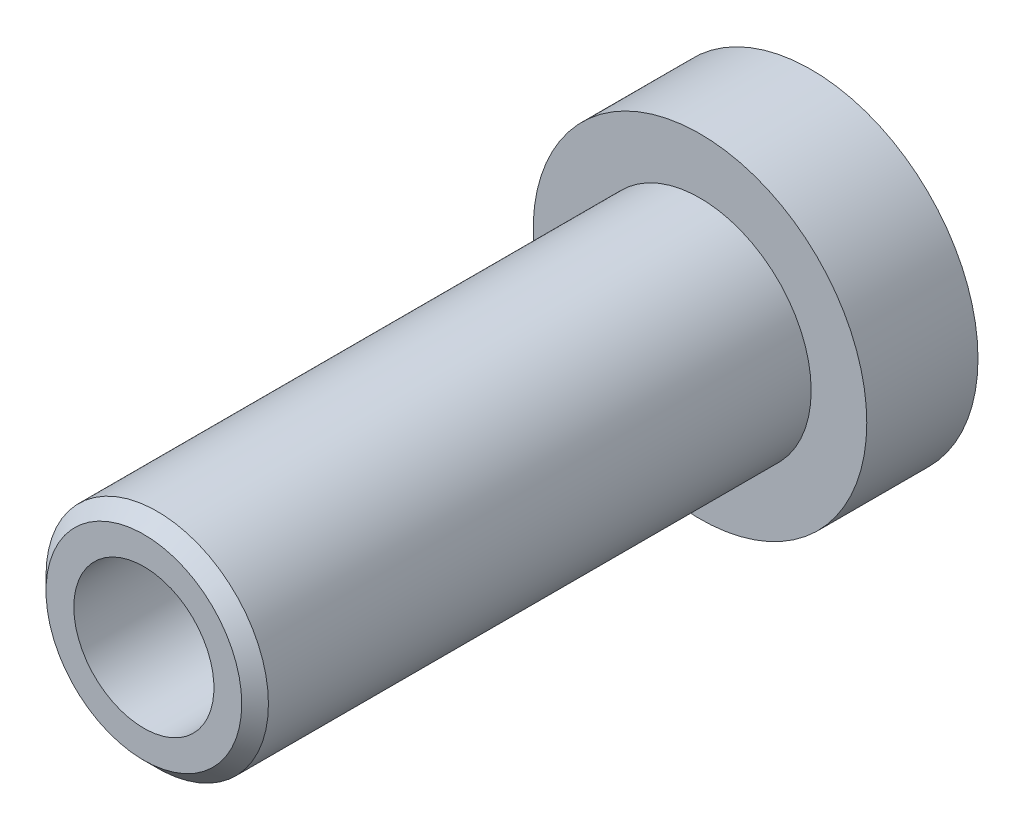
ISO-10303-21;
HEADER;
FILE_DESCRIPTION(('STEP AP214'),'2;1');
FILE_NAME('part.step','',(''),(''),'','','');
FILE_SCHEMA(('AUTOMOTIVE_DESIGN { 1 0 10303 214 1 1 1 1 }'));
ENDSEC;
DATA;
#1=APPLICATION_CONTEXT('core data for automotive mechanical design processes');
#2=APPLICATION_PROTOCOL_DEFINITION('international standard','automotive_design',2000,#1);
#3=PRODUCT_CONTEXT('',#1,'mechanical');
#4=PRODUCT('Part','Part','',(#3));
#5=PRODUCT_RELATED_PRODUCT_CATEGORY('part','',(#4));
#6=PRODUCT_DEFINITION_FORMATION('','',#4);
#7=PRODUCT_DEFINITION_CONTEXT('part definition',#1,'design');
#8=PRODUCT_DEFINITION('design','',#6,#7);
#9=PRODUCT_DEFINITION_SHAPE('','',#8);
#10=(LENGTH_UNIT() NAMED_UNIT(*) SI_UNIT(.MILLI.,.METRE.));
#11=(NAMED_UNIT(*) PLANE_ANGLE_UNIT() SI_UNIT($,.RADIAN.));
#12=(NAMED_UNIT(*) SI_UNIT($,.STERADIAN.) SOLID_ANGLE_UNIT());
#13=UNCERTAINTY_MEASURE_WITH_UNIT(LENGTH_MEASURE(1.E-05),#10,'distance_accuracy_value','');
#14=(GEOMETRIC_REPRESENTATION_CONTEXT(3) GLOBAL_UNCERTAINTY_ASSIGNED_CONTEXT((#13)) GLOBAL_UNIT_ASSIGNED_CONTEXT((#10,
#11,#12)) REPRESENTATION_CONTEXT('',''));
#15=CARTESIAN_POINT('',(0.,0.,0.));
#16=DIRECTION('',(0.,0.,1.));
#17=DIRECTION('',(1.,0.,0.));
#18=AXIS2_PLACEMENT_3D('',#15,#16,#17);
#19=CARTESIAN_POINT('',(0.,0.,0.5));
#20=DIRECTION('',(0.,0.,-1.));
#21=DIRECTION('',(-1.,0.,0.));
#22=AXIS2_PLACEMENT_3D('',#19,#20,#21);
#23=CYLINDRICAL_SURFACE('',#22,0.75);
#24=CARTESIAN_POINT('',(0.,0.,0.5));
#25=DIRECTION('',(0.,0.,1.));
#26=DIRECTION('',(1.,0.,0.));
#27=AXIS2_PLACEMENT_3D('',#24,#25,#26);
#28=CIRCLE('',#27,0.75);
#29=CARTESIAN_POINT('',(0.75,0.,0.5));
#30=VERTEX_POINT('',#29);
#31=EDGE_CURVE('E53',#30,#30,#28,.T.);
#32=ORIENTED_EDGE('',*,*,#31,.F.);
#33=EDGE_LOOP('',(#32));
#34=FACE_BOUND('',#33,.T.);
#35=CARTESIAN_POINT('',(0.,0.,0.));
#36=DIRECTION('',(0.,0.,1.));
#37=DIRECTION('',(1.,0.,0.));
#38=AXIS2_PLACEMENT_3D('',#35,#36,#37);
#39=CIRCLE('',#38,0.75);
#40=CARTESIAN_POINT('',(0.75,0.,0.));
#41=VERTEX_POINT('',#40);
#42=EDGE_CURVE('E56',#41,#41,#39,.T.);
#43=ORIENTED_EDGE('',*,*,#42,.T.);
#44=EDGE_LOOP('',(#43));
#45=FACE_BOUND('',#44,.T.);
#46=ADVANCED_FACE('F37',(#34,#45),#23,.T.);
#47=CARTESIAN_POINT('',(0.,0.,0.5));
#48=DIRECTION('',(0.,0.,1.));
#49=DIRECTION('',(1.,0.,0.));
#50=AXIS2_PLACEMENT_3D('',#47,#48,#49);
#51=PLANE('',#50);
#52=CARTESIAN_POINT('',(0.,0.,0.5));
#53=DIRECTION('',(0.,0.,1.));
#54=DIRECTION('',(1.,0.,0.));
#55=AXIS2_PLACEMENT_3D('',#52,#53,#54);
#56=CIRCLE('',#55,0.5);
#57=CARTESIAN_POINT('',(0.5,0.,0.5));
#58=VERTEX_POINT('',#57);
#59=EDGE_CURVE('E49',#58,#58,#56,.T.);
#60=ORIENTED_EDGE('',*,*,#59,.F.);
#61=EDGE_LOOP('',(#60));
#62=FACE_BOUND('',#61,.T.);
#63=ORIENTED_EDGE('',*,*,#31,.T.);
#64=EDGE_LOOP('',(#63));
#65=FACE_BOUND('',#64,.T.);
#66=ADVANCED_FACE('F80',(#62,#65),#51,.T.);
#67=CARTESIAN_POINT('',(0.,0.,0.));
#68=DIRECTION('',(0.,0.,1.));
#69=DIRECTION('',(1.,0.,0.));
#70=AXIS2_PLACEMENT_3D('',#67,#68,#69);
#71=PLANE('',#70);
#72=CARTESIAN_POINT('',(0.,0.,0.));
#73=DIRECTION('',(0.,0.,-1.));
#74=DIRECTION('',(-1.,0.,0.));
#75=AXIS2_PLACEMENT_3D('',#72,#73,#74);
#76=CIRCLE('',#75,0.315);
#77=CARTESIAN_POINT('',(-0.315,0.,0.));
#78=VERTEX_POINT('',#77);
#79=EDGE_CURVE('E62',#78,#78,#76,.T.);
#80=ORIENTED_EDGE('',*,*,#79,.F.);
#81=EDGE_LOOP('',(#80));
#82=FACE_BOUND('',#81,.T.);
#83=ORIENTED_EDGE('',*,*,#42,.F.);
#84=EDGE_LOOP('',(#83));
#85=FACE_BOUND('',#84,.T.);
#86=ADVANCED_FACE('F76',(#82,#85),#71,.F.);
#87=CARTESIAN_POINT('',(0.,0.,3.));
#88=DIRECTION('',(0.,0.,-1.));
#89=DIRECTION('',(-1.,0.,0.));
#90=AXIS2_PLACEMENT_3D('',#87,#88,#89);
#91=CYLINDRICAL_SURFACE('',#90,0.5);
#92=CARTESIAN_POINT('',(0.,0.,2.94));
#93=DIRECTION('',(0.,0.,1.));
#94=DIRECTION('',(1.,0.,0.));
#95=AXIS2_PLACEMENT_3D('',#92,#93,#94);
#96=CIRCLE('',#95,0.5);
#97=CARTESIAN_POINT('',(0.5,0.,2.94));
#98=VERTEX_POINT('',#97);
#99=EDGE_CURVE('E10',#98,#98,#96,.F.);
#100=ORIENTED_EDGE('',*,*,#99,.T.);
#101=EDGE_LOOP('',(#100));
#102=FACE_BOUND('',#101,.T.);
#103=ORIENTED_EDGE('',*,*,#59,.T.);
#104=EDGE_LOOP('',(#103));
#105=FACE_BOUND('',#104,.T.);
#106=ADVANCED_FACE('F79',(#102,#105),#91,.T.);
#107=CARTESIAN_POINT('',(0.,0.,3.));
#108=DIRECTION('',(0.,0.,1.));
#109=DIRECTION('',(1.,0.,0.));
#110=AXIS2_PLACEMENT_3D('',#107,#108,#109);
#111=PLANE('',#110);
#112=CARTESIAN_POINT('',(0.,0.,3.));
#113=DIRECTION('',(0.,0.,1.));
#114=DIRECTION('',(1.,0.,0.));
#115=AXIS2_PLACEMENT_3D('',#112,#113,#114);
#116=CIRCLE('',#115,0.44);
#117=CARTESIAN_POINT('',(0.44,0.,3.));
#118=VERTEX_POINT('',#117);
#119=EDGE_CURVE('E45',#118,#118,#116,.T.);
#120=ORIENTED_EDGE('',*,*,#119,.T.);
#121=EDGE_LOOP('',(#120));
#122=FACE_BOUND('',#121,.T.);
#123=CARTESIAN_POINT('',(0.,0.,3.));
#124=DIRECTION('',(0.,0.,-1.));
#125=DIRECTION('',(-1.,0.,0.));
#126=AXIS2_PLACEMENT_3D('',#123,#124,#125);
#127=CIRCLE('',#126,0.315);
#128=CARTESIAN_POINT('',(-0.315,0.,3.));
#129=VERTEX_POINT('',#128);
#130=EDGE_CURVE('E59',#129,#129,#127,.T.);
#131=ORIENTED_EDGE('',*,*,#130,.T.);
#132=EDGE_LOOP('',(#131));
#133=FACE_BOUND('',#132,.T.);
#134=ADVANCED_FACE('F68',(#122,#133),#111,.T.);
#135=CARTESIAN_POINT('',(0.,0.,3.));
#136=DIRECTION('',(0.,0.,-1.));
#137=DIRECTION('',(-1.,0.,0.));
#138=AXIS2_PLACEMENT_3D('',#135,#136,#137);
#139=CYLINDRICAL_SURFACE('',#138,0.315);
#140=ORIENTED_EDGE('',*,*,#130,.F.);
#141=EDGE_LOOP('',(#140));
#142=FACE_BOUND('',#141,.T.);
#143=ORIENTED_EDGE('',*,*,#79,.T.);
#144=EDGE_LOOP('',(#143));
#145=FACE_BOUND('',#144,.T.);
#146=ADVANCED_FACE('F70',(#142,#145),#139,.F.);
#147=CARTESIAN_POINT('',(0.,0.,3.));
#148=DIRECTION('',(0.,0.,-1.));
#149=DIRECTION('',(-1.,0.,0.));
#150=AXIS2_PLACEMENT_3D('',#147,#148,#149);
#151=CONICAL_SURFACE('',#150,0.44,0.785398163397445);
#152=ORIENTED_EDGE('',*,*,#99,.F.);
#153=EDGE_LOOP('',(#152));
#154=FACE_BOUND('',#153,.T.);
#155=ORIENTED_EDGE('',*,*,#119,.F.);
#156=EDGE_LOOP('',(#155));
#157=FACE_BOUND('',#156,.T.);
#158=ADVANCED_FACE('F40',(#154,#157),#151,.T.);
#159=CLOSED_SHELL('',(#46,#66,#86,#106,#134,#146,#158));
#160=MANIFOLD_SOLID_BREP('B2',#159);
#161=ADVANCED_BREP_SHAPE_REPRESENTATION('',(#18,#160),#14);
#162=SHAPE_DEFINITION_REPRESENTATION(#9,#161);
ENDSEC;
END-ISO-10303-21;
